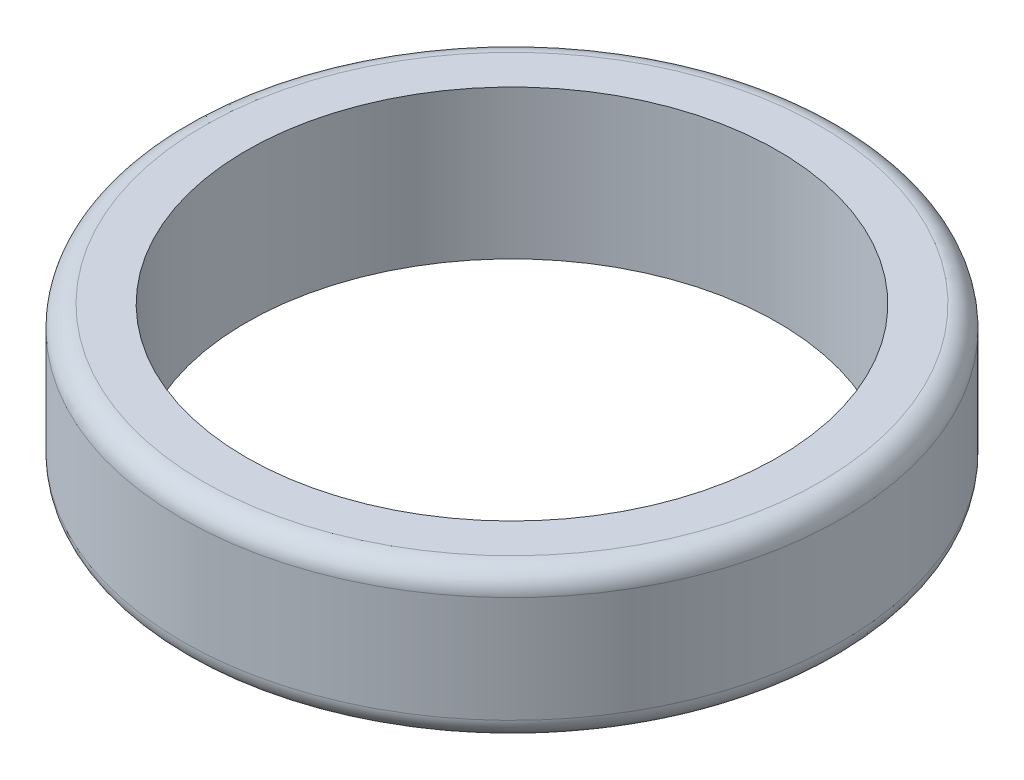
ISO-10303-21;
HEADER;
FILE_DESCRIPTION(('STEP AP214'),'2;1');
FILE_NAME('part.step','',(''),(''),'','','');
FILE_SCHEMA(('AUTOMOTIVE_DESIGN { 1 0 10303 214 1 1 1 1 }'));
ENDSEC;
DATA;
#1=APPLICATION_CONTEXT('core data for automotive mechanical design processes');
#2=APPLICATION_PROTOCOL_DEFINITION('international standard','automotive_design',2000,#1);
#3=PRODUCT_CONTEXT('',#1,'mechanical');
#4=PRODUCT('Part','Part','',(#3));
#5=PRODUCT_RELATED_PRODUCT_CATEGORY('part','',(#4));
#6=PRODUCT_DEFINITION_FORMATION('','',#4);
#7=PRODUCT_DEFINITION_CONTEXT('part definition',#1,'design');
#8=PRODUCT_DEFINITION('design','',#6,#7);
#9=PRODUCT_DEFINITION_SHAPE('','',#8);
#10=(LENGTH_UNIT() NAMED_UNIT(*) SI_UNIT(.MILLI.,.METRE.));
#11=(NAMED_UNIT(*) PLANE_ANGLE_UNIT() SI_UNIT($,.RADIAN.));
#12=(NAMED_UNIT(*) SI_UNIT($,.STERADIAN.) SOLID_ANGLE_UNIT());
#13=UNCERTAINTY_MEASURE_WITH_UNIT(LENGTH_MEASURE(1.E-05),#10,'distance_accuracy_value','');
#14=(GEOMETRIC_REPRESENTATION_CONTEXT(3) GLOBAL_UNCERTAINTY_ASSIGNED_CONTEXT((#13)) GLOBAL_UNIT_ASSIGNED_CONTEXT((#10,
#11,#12)) REPRESENTATION_CONTEXT('',''));
#15=CARTESIAN_POINT('',(0.,0.,0.));
#16=DIRECTION('',(0.,0.,1.));
#17=DIRECTION('',(1.,0.,0.));
#18=AXIS2_PLACEMENT_3D('',#15,#16,#17);
#19=CARTESIAN_POINT('',(0.,7.,0.));
#20=DIRECTION('',(0.,1.,0.));
#21=DIRECTION('',(0.,0.,1.));
#22=AXIS2_PLACEMENT_3D('',#19,#20,#21);
#23=PLANE('',#22);
#24=CARTESIAN_POINT('',(0.,7.,0.));
#25=DIRECTION('',(0.,1.,0.));
#26=DIRECTION('',(0.,0.,1.));
#27=AXIS2_PLACEMENT_3D('',#24,#25,#26);
#28=CIRCLE('',#27,14.5);
#29=CARTESIAN_POINT('',(0.,7.,14.5));
#30=VERTEX_POINT('',#29);
#31=EDGE_CURVE('E10',#30,#30,#28,.T.);
#32=ORIENTED_EDGE('',*,*,#31,.T.);
#33=EDGE_LOOP('',(#32));
#34=FACE_BOUND('',#33,.T.);
#35=CARTESIAN_POINT('',(0.,7.,0.));
#36=DIRECTION('',(0.,1.,0.));
#37=DIRECTION('',(0.,0.,1.));
#38=AXIS2_PLACEMENT_3D('',#35,#36,#37);
#39=CIRCLE('',#38,12.5);
#40=CARTESIAN_POINT('',(0.,7.,12.5));
#41=VERTEX_POINT('',#40);
#42=EDGE_CURVE('E51',#41,#41,#39,.T.);
#43=ORIENTED_EDGE('',*,*,#42,.F.);
#44=EDGE_LOOP('',(#43));
#45=FACE_BOUND('',#44,.T.);
#46=ADVANCED_FACE('F31',(#34,#45),#23,.T.);
#47=CARTESIAN_POINT('',(0.,0.,0.));
#48=DIRECTION('',(0.,1.,0.));
#49=DIRECTION('',(0.,0.,1.));
#50=AXIS2_PLACEMENT_3D('',#47,#48,#49);
#51=PLANE('',#50);
#52=CARTESIAN_POINT('',(0.,0.,0.));
#53=DIRECTION('',(0.,1.,0.));
#54=DIRECTION('',(0.,0.,1.));
#55=AXIS2_PLACEMENT_3D('',#52,#53,#54);
#56=CIRCLE('',#55,14.5);
#57=CARTESIAN_POINT('',(0.,0.,14.5));
#58=VERTEX_POINT('',#57);
#59=EDGE_CURVE('E38',#58,#58,#56,.F.);
#60=ORIENTED_EDGE('',*,*,#59,.T.);
#61=EDGE_LOOP('',(#60));
#62=FACE_BOUND('',#61,.T.);
#63=CARTESIAN_POINT('',(0.,0.,0.));
#64=DIRECTION('',(0.,1.,0.));
#65=DIRECTION('',(0.,0.,1.));
#66=AXIS2_PLACEMENT_3D('',#63,#64,#65);
#67=CIRCLE('',#66,12.5);
#68=CARTESIAN_POINT('',(0.,0.,12.5));
#69=VERTEX_POINT('',#68);
#70=EDGE_CURVE('E52',#69,#69,#67,.T.);
#71=ORIENTED_EDGE('',*,*,#70,.T.);
#72=EDGE_LOOP('',(#71));
#73=FACE_BOUND('',#72,.T.);
#74=ADVANCED_FACE('F62',(#62,#73),#51,.F.);
#75=CARTESIAN_POINT('',(0.,7.,0.));
#76=DIRECTION('',(0.,-1.,0.));
#77=DIRECTION('',(0.,0.,-1.));
#78=AXIS2_PLACEMENT_3D('',#75,#76,#77);
#79=CYLINDRICAL_SURFACE('',#78,15.5);
#80=CARTESIAN_POINT('',(0.,1.,0.));
#81=DIRECTION('',(0.,1.,0.));
#82=DIRECTION('',(0.,0.,1.));
#83=AXIS2_PLACEMENT_3D('',#80,#81,#82);
#84=CIRCLE('',#83,15.5);
#85=CARTESIAN_POINT('',(0.,1.,15.5));
#86=VERTEX_POINT('',#85);
#87=EDGE_CURVE('E42',#86,#86,#84,.T.);
#88=ORIENTED_EDGE('',*,*,#87,.T.);
#89=EDGE_LOOP('',(#88));
#90=FACE_BOUND('',#89,.T.);
#91=CARTESIAN_POINT('',(0.,6.,0.));
#92=DIRECTION('',(0.,1.,0.));
#93=DIRECTION('',(0.,0.,1.));
#94=AXIS2_PLACEMENT_3D('',#91,#92,#93);
#95=CIRCLE('',#94,15.5);
#96=CARTESIAN_POINT('',(0.,6.,15.5));
#97=VERTEX_POINT('',#96);
#98=EDGE_CURVE('E46',#97,#97,#95,.F.);
#99=ORIENTED_EDGE('',*,*,#98,.T.);
#100=EDGE_LOOP('',(#99));
#101=FACE_BOUND('',#100,.T.);
#102=ADVANCED_FACE('F67',(#90,#101),#79,.T.);
#103=CARTESIAN_POINT('',(0.,7.,0.));
#104=DIRECTION('',(0.,-1.,0.));
#105=DIRECTION('',(0.,0.,-1.));
#106=AXIS2_PLACEMENT_3D('',#103,#104,#105);
#107=CYLINDRICAL_SURFACE('',#106,12.5);
#108=ORIENTED_EDGE('',*,*,#42,.T.);
#109=EDGE_LOOP('',(#108));
#110=FACE_BOUND('',#109,.T.);
#111=ORIENTED_EDGE('',*,*,#70,.F.);
#112=EDGE_LOOP('',(#111));
#113=FACE_BOUND('',#112,.T.);
#114=ADVANCED_FACE('F58',(#110,#113),#107,.F.);
#115=CARTESIAN_POINT('',(0.,1.,0.));
#116=DIRECTION('',(0.,1.,0.));
#117=DIRECTION('',(0.,0.,1.));
#118=AXIS2_PLACEMENT_3D('',#115,#116,#117);
#119=TOROIDAL_SURFACE('',#118,14.5,1.);
#120=ORIENTED_EDGE('',*,*,#59,.F.);
#121=EDGE_LOOP('',(#120));
#122=FACE_BOUND('',#121,.T.);
#123=ORIENTED_EDGE('',*,*,#87,.F.);
#124=EDGE_LOOP('',(#123));
#125=FACE_BOUND('',#124,.T.);
#126=ADVANCED_FACE('F73',(#122,#125),#119,.T.);
#127=CARTESIAN_POINT('',(0.,6.,0.));
#128=DIRECTION('',(0.,1.,0.));
#129=DIRECTION('',(0.,0.,1.));
#130=AXIS2_PLACEMENT_3D('',#127,#128,#129);
#131=TOROIDAL_SURFACE('',#130,14.5,1.);
#132=ORIENTED_EDGE('',*,*,#98,.F.);
#133=EDGE_LOOP('',(#132));
#134=FACE_BOUND('',#133,.T.);
#135=ORIENTED_EDGE('',*,*,#31,.F.);
#136=EDGE_LOOP('',(#135));
#137=FACE_BOUND('',#136,.T.);
#138=ADVANCED_FACE('F33',(#134,#137),#131,.T.);
#139=CLOSED_SHELL('',(#46,#74,#102,#114,#126,#138));
#140=MANIFOLD_SOLID_BREP('B2',#139);
#141=ADVANCED_BREP_SHAPE_REPRESENTATION('',(#18,#140),#14);
#142=SHAPE_DEFINITION_REPRESENTATION(#9,#141);
ENDSEC;
END-ISO-10303-21;
